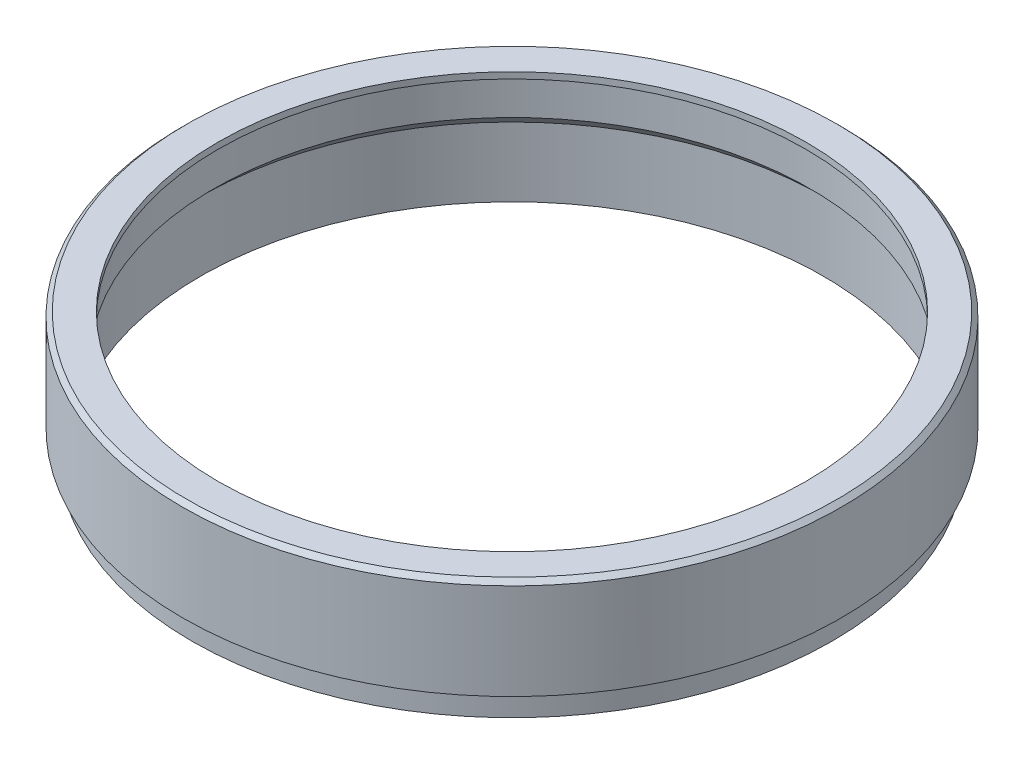
ISO-10303-21;
HEADER;
FILE_DESCRIPTION(('STEP AP214'),'2;1');
FILE_NAME('part.step','',(''),(''),'','','');
FILE_SCHEMA(('AUTOMOTIVE_DESIGN { 1 0 10303 214 1 1 1 1 }'));
ENDSEC;
DATA;
#1=APPLICATION_CONTEXT('core data for automotive mechanical design processes');
#2=APPLICATION_PROTOCOL_DEFINITION('international standard','automotive_design',2000,#1);
#3=PRODUCT_CONTEXT('',#1,'mechanical');
#4=PRODUCT('Part','Part','',(#3));
#5=PRODUCT_RELATED_PRODUCT_CATEGORY('part','',(#4));
#6=PRODUCT_DEFINITION_FORMATION('','',#4);
#7=PRODUCT_DEFINITION_CONTEXT('part definition',#1,'design');
#8=PRODUCT_DEFINITION('design','',#6,#7);
#9=PRODUCT_DEFINITION_SHAPE('','',#8);
#10=(LENGTH_UNIT() NAMED_UNIT(*) SI_UNIT(.MILLI.,.METRE.));
#11=(NAMED_UNIT(*) PLANE_ANGLE_UNIT() SI_UNIT($,.RADIAN.));
#12=(NAMED_UNIT(*) SI_UNIT($,.STERADIAN.) SOLID_ANGLE_UNIT());
#13=UNCERTAINTY_MEASURE_WITH_UNIT(LENGTH_MEASURE(1.E-05),#10,'distance_accuracy_value','');
#14=(GEOMETRIC_REPRESENTATION_CONTEXT(3) GLOBAL_UNCERTAINTY_ASSIGNED_CONTEXT((#13)) GLOBAL_UNIT_ASSIGNED_CONTEXT((#10,
#11,#12)) REPRESENTATION_CONTEXT('',''));
#15=CARTESIAN_POINT('',(0.,0.,0.));
#16=DIRECTION('',(0.,0.,1.));
#17=DIRECTION('',(1.,0.,0.));
#18=AXIS2_PLACEMENT_3D('',#15,#16,#17);
#19=CARTESIAN_POINT('',(0.,10.96,0.));
#20=DIRECTION('',(0.,-1.,0.));
#21=DIRECTION('',(1.,0.,0.));
#22=AXIS2_PLACEMENT_3D('',#19,#20,#21);
#23=CONICAL_SURFACE('',#22,35.,0.785398163397451);
#24=CARTESIAN_POINT('',(0.,10.96,0.));
#25=DIRECTION('',(0.,1.,0.));
#26=DIRECTION('',(0.,0.,1.));
#27=AXIS2_PLACEMENT_3D('',#24,#25,#26);
#28=CIRCLE('',#27,35.);
#29=CARTESIAN_POINT('',(0.,10.96,35.));
#30=VERTEX_POINT('',#29);
#31=EDGE_CURVE('E29',#30,#30,#28,.F.);
#32=ORIENTED_EDGE('',*,*,#31,.T.);
#33=EDGE_LOOP('',(#32));
#34=FACE_BOUND('',#33,.T.);
#35=CARTESIAN_POINT('',(0.,12.46,0.));
#36=DIRECTION('',(0.,1.,0.));
#37=DIRECTION('',(0.,0.,1.));
#38=AXIS2_PLACEMENT_3D('',#35,#36,#37);
#39=CIRCLE('',#38,33.5);
#40=CARTESIAN_POINT('',(0.,12.46,33.5));
#41=VERTEX_POINT('',#40);
#42=EDGE_CURVE('E32',#41,#41,#39,.T.);
#43=ORIENTED_EDGE('',*,*,#42,.T.);
#44=EDGE_LOOP('',(#43));
#45=FACE_BOUND('',#44,.T.);
#46=ADVANCED_FACE('F14',(#34,#45),#23,.F.);
#47=CARTESIAN_POINT('',(0.,0.,0.));
#48=DIRECTION('',(0.,1.,0.));
#49=DIRECTION('',(0.,0.,1.));
#50=AXIS2_PLACEMENT_3D('',#47,#48,#49);
#51=CYLINDRICAL_SURFACE('',#50,33.5);
#52=CARTESIAN_POINT('',(0.,16.56,0.));
#53=DIRECTION('',(0.,1.,0.));
#54=DIRECTION('',(0.,0.,1.));
#55=AXIS2_PLACEMENT_3D('',#52,#53,#54);
#56=CIRCLE('',#55,33.5);
#57=CARTESIAN_POINT('',(0.,16.56,33.5));
#58=VERTEX_POINT('',#57);
#59=EDGE_CURVE('E17',#58,#58,#56,.F.);
#60=ORIENTED_EDGE('',*,*,#59,.F.);
#61=EDGE_LOOP('',(#60));
#62=FACE_BOUND('',#61,.T.);
#63=ORIENTED_EDGE('',*,*,#42,.F.);
#64=EDGE_LOOP('',(#63));
#65=FACE_BOUND('',#64,.T.);
#66=ADVANCED_FACE('F58',(#62,#65),#51,.F.);
#67=CARTESIAN_POINT('',(0.,0.,0.));
#68=DIRECTION('',(0.,1.,0.));
#69=DIRECTION('',(0.,0.,1.));
#70=AXIS2_PLACEMENT_3D('',#67,#68,#69);
#71=CYLINDRICAL_SURFACE('',#70,35.);
#72=ORIENTED_EDGE('',*,*,#31,.F.);
#73=EDGE_LOOP('',(#72));
#74=FACE_BOUND('',#73,.T.);
#75=CARTESIAN_POINT('',(0.,3.2,0.));
#76=DIRECTION('',(0.,1.,0.));
#77=DIRECTION('',(0.,0.,1.));
#78=AXIS2_PLACEMENT_3D('',#75,#76,#77);
#79=CIRCLE('',#78,35.);
#80=CARTESIAN_POINT('',(0.,3.2,35.));
#81=VERTEX_POINT('',#80);
#82=EDGE_CURVE('E48',#81,#81,#79,.T.);
#83=ORIENTED_EDGE('',*,*,#82,.F.);
#84=EDGE_LOOP('',(#83));
#85=FACE_BOUND('',#84,.T.);
#86=ADVANCED_FACE('F61',(#74,#85),#71,.F.);
#87=CARTESIAN_POINT('',(-33.5,16.56,0.));
#88=DIRECTION('',(0.,-1.,0.));
#89=DIRECTION('',(0.,0.,-1.));
#90=AXIS2_PLACEMENT_3D('',#87,#88,#89);
#91=PLANE('',#90);
#92=ORIENTED_EDGE('',*,*,#59,.T.);
#93=EDGE_LOOP('',(#92));
#94=FACE_BOUND('',#93,.T.);
#95=CARTESIAN_POINT('',(0.,16.56,0.));
#96=DIRECTION('',(0.,1.,0.));
#97=DIRECTION('',(0.,0.,1.));
#98=AXIS2_PLACEMENT_3D('',#95,#96,#97);
#99=CIRCLE('',#98,33.);
#100=CARTESIAN_POINT('',(0.,16.56,33.));
#101=VERTEX_POINT('',#100);
#102=EDGE_CURVE('E46',#101,#101,#99,.T.);
#103=ORIENTED_EDGE('',*,*,#102,.T.);
#104=EDGE_LOOP('',(#103));
#105=FACE_BOUND('',#104,.T.);
#106=ADVANCED_FACE('F55',(#94,#105),#91,.T.);
#107=CARTESIAN_POINT('',(-35.95,3.2,0.));
#108=DIRECTION('',(0.,-1.,0.));
#109=DIRECTION('',(0.,0.,-1.));
#110=AXIS2_PLACEMENT_3D('',#107,#108,#109);
#111=PLANE('',#110);
#112=CARTESIAN_POINT('',(0.,3.2,0.));
#113=DIRECTION('',(0.,1.,0.));
#114=DIRECTION('',(0.,0.,1.));
#115=AXIS2_PLACEMENT_3D('',#112,#113,#114);
#116=CIRCLE('',#115,35.95);
#117=CARTESIAN_POINT('',(0.,3.2,35.95));
#118=VERTEX_POINT('',#117);
#119=EDGE_CURVE('E43',#118,#118,#116,.T.);
#120=ORIENTED_EDGE('',*,*,#119,.F.);
#121=EDGE_LOOP('',(#120));
#122=FACE_BOUND('',#121,.T.);
#123=ORIENTED_EDGE('',*,*,#82,.T.);
#124=EDGE_LOOP('',(#123));
#125=FACE_BOUND('',#124,.T.);
#126=ADVANCED_FACE('F95',(#122,#125),#111,.T.);
#127=CARTESIAN_POINT('',(0.,0.,0.));
#128=DIRECTION('',(0.,1.,0.));
#129=DIRECTION('',(0.,0.,1.));
#130=AXIS2_PLACEMENT_3D('',#127,#128,#129);
#131=CYLINDRICAL_SURFACE('',#130,33.);
#132=CARTESIAN_POINT('',(0.,17.26,0.));
#133=DIRECTION('',(0.,1.,0.));
#134=DIRECTION('',(0.,0.,1.));
#135=AXIS2_PLACEMENT_3D('',#132,#133,#134);
#136=CIRCLE('',#135,33.);
#137=CARTESIAN_POINT('',(0.,17.26,33.));
#138=VERTEX_POINT('',#137);
#139=EDGE_CURVE('E40',#138,#138,#136,.F.);
#140=ORIENTED_EDGE('',*,*,#139,.F.);
#141=EDGE_LOOP('',(#140));
#142=FACE_BOUND('',#141,.T.);
#143=ORIENTED_EDGE('',*,*,#102,.F.);
#144=EDGE_LOOP('',(#143));
#145=FACE_BOUND('',#144,.T.);
#146=ADVANCED_FACE('F91',(#142,#145),#131,.F.);
#147=CARTESIAN_POINT('',(0.,0.,0.));
#148=DIRECTION('',(0.,1.,0.));
#149=DIRECTION('',(0.,0.,1.));
#150=AXIS2_PLACEMENT_3D('',#147,#148,#149);
#151=CYLINDRICAL_SURFACE('',#150,35.95);
#152=ORIENTED_EDGE('',*,*,#119,.T.);
#153=EDGE_LOOP('',(#152));
#154=FACE_BOUND('',#153,.T.);
#155=CARTESIAN_POINT('',(0.,6.,0.));
#156=DIRECTION('',(0.,1.,0.));
#157=DIRECTION('',(0.,0.,1.));
#158=AXIS2_PLACEMENT_3D('',#155,#156,#157);
#159=CIRCLE('',#158,35.95);
#160=CARTESIAN_POINT('',(0.,6.,35.95));
#161=VERTEX_POINT('',#160);
#162=EDGE_CURVE('E37',#161,#161,#159,.T.);
#163=ORIENTED_EDGE('',*,*,#162,.F.);
#164=EDGE_LOOP('',(#163));
#165=FACE_BOUND('',#164,.T.);
#166=ADVANCED_FACE('F87',(#154,#165),#151,.T.);
#167=CARTESIAN_POINT('',(-33.,17.26,0.));
#168=DIRECTION('',(0.,1.,0.));
#169=DIRECTION('',(0.,0.,1.));
#170=AXIS2_PLACEMENT_3D('',#167,#168,#169);
#171=PLANE('',#170);
#172=ORIENTED_EDGE('',*,*,#139,.T.);
#173=EDGE_LOOP('',(#172));
#174=FACE_BOUND('',#173,.T.);
#175=CARTESIAN_POINT('',(0.,17.26,0.));
#176=DIRECTION('',(0.,-1.,0.));
#177=DIRECTION('',(0.,0.,-1.));
#178=AXIS2_PLACEMENT_3D('',#175,#176,#177);
#179=CIRCLE('',#178,36.5);
#180=CARTESIAN_POINT('',(0.,17.26,-36.5));
#181=VERTEX_POINT('',#180);
#182=EDGE_CURVE('E26',#181,#181,#179,.T.);
#183=ORIENTED_EDGE('',*,*,#182,.F.);
#184=EDGE_LOOP('',(#183));
#185=FACE_BOUND('',#184,.T.);
#186=ADVANCED_FACE('F83',(#174,#185),#171,.T.);
#187=CARTESIAN_POINT('',(-37.,6.,0.));
#188=DIRECTION('',(0.,-1.,0.));
#189=DIRECTION('',(0.,0.,-1.));
#190=AXIS2_PLACEMENT_3D('',#187,#188,#189);
#191=PLANE('',#190);
#192=CARTESIAN_POINT('',(0.,6.,0.));
#193=DIRECTION('',(0.,1.,0.));
#194=DIRECTION('',(0.,0.,1.));
#195=AXIS2_PLACEMENT_3D('',#192,#193,#194);
#196=CIRCLE('',#195,37.);
#197=CARTESIAN_POINT('',(0.,6.,37.));
#198=VERTEX_POINT('',#197);
#199=EDGE_CURVE('E21',#198,#198,#196,.T.);
#200=ORIENTED_EDGE('',*,*,#199,.F.);
#201=EDGE_LOOP('',(#200));
#202=FACE_BOUND('',#201,.T.);
#203=ORIENTED_EDGE('',*,*,#162,.T.);
#204=EDGE_LOOP('',(#203));
#205=FACE_BOUND('',#204,.T.);
#206=ADVANCED_FACE('F76',(#202,#205),#191,.T.);
#207=CARTESIAN_POINT('',(0.,16.76,0.));
#208=DIRECTION('',(0.,-1.,0.));
#209=DIRECTION('',(0.,0.,-1.));
#210=AXIS2_PLACEMENT_3D('',#207,#208,#209);
#211=CONICAL_SURFACE('',#210,37.,0.785398163397448);
#212=CARTESIAN_POINT('',(0.,16.76,0.));
#213=DIRECTION('',(0.,1.,0.));
#214=DIRECTION('',(0.,0.,1.));
#215=AXIS2_PLACEMENT_3D('',#212,#213,#214);
#216=CIRCLE('',#215,37.);
#217=CARTESIAN_POINT('',(0.,16.76,37.));
#218=VERTEX_POINT('',#217);
#219=EDGE_CURVE('E10',#218,#218,#216,.F.);
#220=ORIENTED_EDGE('',*,*,#219,.F.);
#221=EDGE_LOOP('',(#220));
#222=FACE_BOUND('',#221,.T.);
#223=ORIENTED_EDGE('',*,*,#182,.T.);
#224=EDGE_LOOP('',(#223));
#225=FACE_BOUND('',#224,.T.);
#226=ADVANCED_FACE('F71',(#222,#225),#211,.T.);
#227=CARTESIAN_POINT('',(0.,0.,0.));
#228=DIRECTION('',(0.,1.,0.));
#229=DIRECTION('',(0.,0.,1.));
#230=AXIS2_PLACEMENT_3D('',#227,#228,#229);
#231=CYLINDRICAL_SURFACE('',#230,37.);
#232=ORIENTED_EDGE('',*,*,#219,.T.);
#233=EDGE_LOOP('',(#232));
#234=FACE_BOUND('',#233,.T.);
#235=ORIENTED_EDGE('',*,*,#199,.T.);
#236=EDGE_LOOP('',(#235));
#237=FACE_BOUND('',#236,.T.);
#238=ADVANCED_FACE('F69',(#234,#237),#231,.T.);
#239=CLOSED_SHELL('',(#46,#66,#86,#106,#126,#146,#166,#186,#206,#226,#238));
#240=MANIFOLD_SOLID_BREP('B1',#239);
#241=ADVANCED_BREP_SHAPE_REPRESENTATION('',(#18,#240),#14);
#242=SHAPE_DEFINITION_REPRESENTATION(#9,#241);
ENDSEC;
END-ISO-10303-21;
